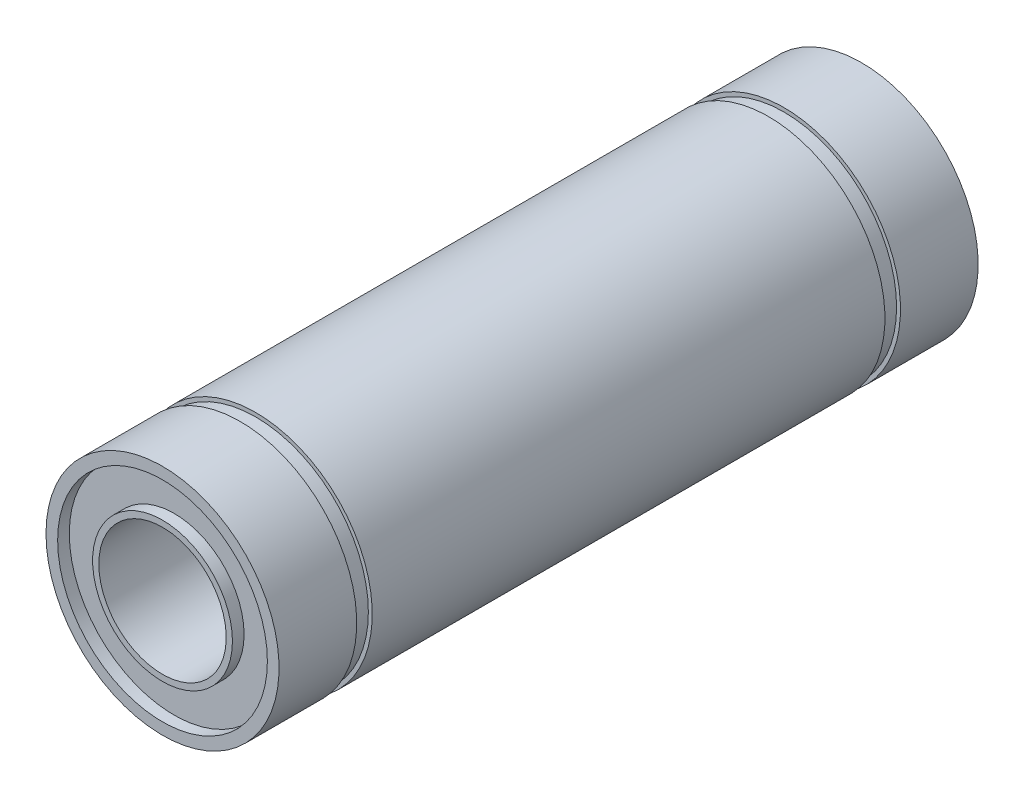
ISO-10303-21;
HEADER;
FILE_DESCRIPTION(('STEP AP214'),'2;1');
FILE_NAME('part.step','',(''),(''),'','','');
FILE_SCHEMA(('AUTOMOTIVE_DESIGN { 1 0 10303 214 1 1 1 1 }'));
ENDSEC;
DATA;
#1=APPLICATION_CONTEXT('core data for automotive mechanical design processes');
#2=APPLICATION_PROTOCOL_DEFINITION('international standard','automotive_design',2000,#1);
#3=PRODUCT_CONTEXT('',#1,'mechanical');
#4=PRODUCT('Part','Part','',(#3));
#5=PRODUCT_RELATED_PRODUCT_CATEGORY('part','',(#4));
#6=PRODUCT_DEFINITION_FORMATION('','',#4);
#7=PRODUCT_DEFINITION_CONTEXT('part definition',#1,'design');
#8=PRODUCT_DEFINITION('design','',#6,#7);
#9=PRODUCT_DEFINITION_SHAPE('','',#8);
#10=(LENGTH_UNIT() NAMED_UNIT(*) SI_UNIT(.MILLI.,.METRE.));
#11=(NAMED_UNIT(*) PLANE_ANGLE_UNIT() SI_UNIT($,.RADIAN.));
#12=(NAMED_UNIT(*) SI_UNIT($,.STERADIAN.) SOLID_ANGLE_UNIT());
#13=UNCERTAINTY_MEASURE_WITH_UNIT(LENGTH_MEASURE(1.E-05),#10,'distance_accuracy_value','');
#14=(GEOMETRIC_REPRESENTATION_CONTEXT(3) GLOBAL_UNCERTAINTY_ASSIGNED_CONTEXT((#13)) GLOBAL_UNIT_ASSIGNED_CONTEXT((#10,
#11,#12)) REPRESENTATION_CONTEXT('',''));
#15=CARTESIAN_POINT('',(0.,0.,0.));
#16=DIRECTION('',(0.,0.,1.));
#17=DIRECTION('',(1.,0.,0.));
#18=AXIS2_PLACEMENT_3D('',#15,#16,#17);
#19=CARTESIAN_POINT('',(0.,0.,45.));
#20=DIRECTION('',(0.,0.,-1.));
#21=DIRECTION('',(-1.,0.,0.));
#22=AXIS2_PLACEMENT_3D('',#19,#20,#21);
#23=CYLINDRICAL_SURFACE('',#22,7.5);
#24=CARTESIAN_POINT('',(0.,0.,0.));
#25=DIRECTION('',(0.,0.,1.));
#26=DIRECTION('',(1.,0.,0.));
#27=AXIS2_PLACEMENT_3D('',#24,#25,#26);
#28=CIRCLE('',#27,7.5);
#29=CARTESIAN_POINT('',(-7.5,0.,0.));
#30=VERTEX_POINT('',#29);
#31=EDGE_CURVE('E34',#30,#30,#28,.T.);
#32=CARTESIAN_POINT('',(0.,0.,5.));
#33=DIRECTION('',(0.,0.,1.));
#34=DIRECTION('',(1.,0.,0.));
#35=AXIS2_PLACEMENT_3D('',#32,#33,#34);
#36=CIRCLE('',#35,7.5);
#37=CARTESIAN_POINT('',(-7.5,0.,5.));
#38=VERTEX_POINT('',#37);
#39=EDGE_CURVE('E84',#38,#38,#36,.T.);
#40=CARTESIAN_POINT('',(-7.5,0.,0.));
#41=CARTESIAN_POINT('',(-7.5,0.,0.0520833333333253));
#42=CARTESIAN_POINT('',(-7.5,0.,0.104166666666657));
#43=CARTESIAN_POINT('',(-7.5,0.,0.208333333333324));
#44=CARTESIAN_POINT('',(-7.5,0.,0.260416666666659));
#45=CARTESIAN_POINT('',(-7.5,0.,0.364583333333328));
#46=CARTESIAN_POINT('',(-7.5,0.,0.416666666666662));
#47=CARTESIAN_POINT('',(-7.5,0.,0.520833333333329));
#48=CARTESIAN_POINT('',(-7.5,0.,0.572916666666661));
#49=CARTESIAN_POINT('',(-7.5,0.,0.677083333333326));
#50=CARTESIAN_POINT('',(-7.5,0.,0.729166666666658));
#51=CARTESIAN_POINT('',(-7.5,0.,0.833333333333325));
#52=CARTESIAN_POINT('',(-7.5,0.,0.885416666666659));
#53=CARTESIAN_POINT('',(-7.5,0.,0.989583333333328));
#54=CARTESIAN_POINT('',(-7.5,0.,1.04166666666666));
#55=CARTESIAN_POINT('',(-7.5,0.,1.14583333333333));
#56=CARTESIAN_POINT('',(-7.5,0.,1.19791666666666));
#57=CARTESIAN_POINT('',(-7.5,0.,1.30208333333333));
#58=CARTESIAN_POINT('',(-7.5,0.,1.35416666666666));
#59=CARTESIAN_POINT('',(-7.5,0.,1.45833333333333));
#60=CARTESIAN_POINT('',(-7.5,0.,1.51041666666666));
#61=CARTESIAN_POINT('',(-7.5,0.,1.61458333333333));
#62=CARTESIAN_POINT('',(-7.5,0.,1.66666666666666));
#63=CARTESIAN_POINT('',(-7.5,0.,1.77083333333333));
#64=CARTESIAN_POINT('',(-7.5,0.,1.82291666666666));
#65=CARTESIAN_POINT('',(-7.5,0.,1.92708333333333));
#66=CARTESIAN_POINT('',(-7.5,0.,1.97916666666666));
#67=CARTESIAN_POINT('',(-7.5,0.,2.08333333333333));
#68=CARTESIAN_POINT('',(-7.5,0.,2.13541666666666));
#69=CARTESIAN_POINT('',(-7.5,0.,2.23958333333333));
#70=CARTESIAN_POINT('',(-7.5,0.,2.29166666666666));
#71=CARTESIAN_POINT('',(-7.5,0.,2.39583333333333));
#72=CARTESIAN_POINT('',(-7.5,0.,2.44791666666666));
#73=CARTESIAN_POINT('',(-7.5,0.,2.55208333333333));
#74=CARTESIAN_POINT('',(-7.5,0.,2.60416666666666));
#75=CARTESIAN_POINT('',(-7.5,0.,2.70833333333333));
#76=CARTESIAN_POINT('',(-7.5,0.,2.76041666666666));
#77=CARTESIAN_POINT('',(-7.5,0.,2.86458333333333));
#78=CARTESIAN_POINT('',(-7.5,0.,2.91666666666666));
#79=CARTESIAN_POINT('',(-7.5,0.,3.02083333333333));
#80=CARTESIAN_POINT('',(-7.5,0.,3.07291666666666));
#81=CARTESIAN_POINT('',(-7.5,0.,3.17708333333333));
#82=CARTESIAN_POINT('',(-7.5,0.,3.22916666666666));
#83=CARTESIAN_POINT('',(-7.5,0.,3.33333333333333));
#84=CARTESIAN_POINT('',(-7.5,0.,3.38541666666666));
#85=CARTESIAN_POINT('',(-7.5,0.,3.48958333333333));
#86=CARTESIAN_POINT('',(-7.5,0.,3.54166666666667));
#87=CARTESIAN_POINT('',(-7.5,0.,3.64583333333333));
#88=CARTESIAN_POINT('',(-7.5,0.,3.69791666666666));
#89=CARTESIAN_POINT('',(-7.5,0.,3.80208333333333));
#90=CARTESIAN_POINT('',(-7.5,0.,3.85416666666666));
#91=CARTESIAN_POINT('',(-7.5,0.,3.95833333333333));
#92=CARTESIAN_POINT('',(-7.5,0.,4.01041666666666));
#93=CARTESIAN_POINT('',(-7.5,0.,4.11458333333333));
#94=CARTESIAN_POINT('',(-7.5,0.,4.16666666666667));
#95=CARTESIAN_POINT('',(-7.5,0.,4.27083333333333));
#96=CARTESIAN_POINT('',(-7.5,0.,4.32291666666667));
#97=CARTESIAN_POINT('',(-7.5,0.,4.42708333333333));
#98=CARTESIAN_POINT('',(-7.5,0.,4.47916666666666));
#99=CARTESIAN_POINT('',(-7.5,0.,4.58333333333333));
#100=CARTESIAN_POINT('',(-7.5,0.,4.63541666666666));
#101=CARTESIAN_POINT('',(-7.5,0.,4.73958333333333));
#102=CARTESIAN_POINT('',(-7.5,0.,4.79166666666667));
#103=CARTESIAN_POINT('',(-7.5,0.,4.89583333333333));
#104=CARTESIAN_POINT('',(-7.5,0.,4.94791666666667));
#105=CARTESIAN_POINT('',(-7.5,0.,5.));
#106=B_SPLINE_CURVE_WITH_KNOTS('',3,(#40,#41,#42,#43,#44,#45,#46,#47,#48,#49,#50,#51,#52,#53,
#54,#55,#56,#57,#58,#59,#60,#61,#62,#63,#64,#65,#66,#67,#68,#69,#70,#71,#72,#73,#74,#75,#76,#77,
#78,#79,#80,#81,#82,#83,#84,#85,#86,#87,#88,#89,#90,#91,#92,#93,#94,#95,#96,#97,#98,#99,#100,
#101,#102,#103,#104,#105),.UNSPECIFIED.,.F.,.F.,(4,2,2,2,2,2,2,2,2,2,2,2,2,2,2,2,2,2,2,2,2,2,2,
2,2,2,2,2,2,2,2,2,4),(0.,0.156249999999997,0.3125,0.468750000000004,0.625000000000001,
0.781249999999997,0.937500000000001,1.09375,1.25,1.40625,1.5625,1.71875,1.875,2.03125,2.1875,
2.34375000000001,2.5,2.65625,2.8125,2.96875000000001,3.125,3.28125,3.4375,3.59375000000001,3.75,
3.90625,4.0625,4.21875000000001,4.375,4.53125,4.6875,4.84375000000001,5.),.UNSPECIFIED.);
#107=EDGE_CURVE('BSEAM31',#30,#38,#106,.T.);
#108=ORIENTED_EDGE('',*,*,#31,.T.);
#109=ORIENTED_EDGE('',*,*,#39,.F.);
#110=ORIENTED_EDGE('',*,*,#107,.T.);
#111=ORIENTED_EDGE('',*,*,#107,.F.);
#112=EDGE_LOOP('',(#108,#110,#109,#111));
#113=FACE_BOUND('',#112,.T.);
#114=ADVANCED_FACE('F31',(#113),#23,.T.);
#115=CARTESIAN_POINT('',(0.,0.,39.));
#116=DIRECTION('',(0.,0.,1.));
#117=DIRECTION('',(1.,0.,0.));
#118=AXIS2_PLACEMENT_3D('',#115,#116,#117);
#119=CIRCLE('',#118,7.5);
#120=CARTESIAN_POINT('',(-7.5,0.,39.));
#121=VERTEX_POINT('',#120);
#122=EDGE_CURVE('E70',#121,#121,#119,.T.);
#123=CARTESIAN_POINT('',(0.,0.,6.));
#124=DIRECTION('',(0.,0.,1.));
#125=DIRECTION('',(1.,0.,0.));
#126=AXIS2_PLACEMENT_3D('',#123,#124,#125);
#127=CIRCLE('',#126,7.5);
#128=CARTESIAN_POINT('',(-7.5,0.,6.));
#129=VERTEX_POINT('',#128);
#130=EDGE_CURVE('E93',#129,#129,#127,.T.);
#131=CARTESIAN_POINT('',(-7.5,0.,39.));
#132=CARTESIAN_POINT('',(-7.5,0.,38.65625));
#133=CARTESIAN_POINT('',(-7.5,0.,38.3125));
#134=CARTESIAN_POINT('',(-7.5,0.,37.625));
#135=CARTESIAN_POINT('',(-7.5,0.,37.28125));
#136=CARTESIAN_POINT('',(-7.5,0.,36.59375));
#137=CARTESIAN_POINT('',(-7.5,0.,36.25));
#138=CARTESIAN_POINT('',(-7.5,0.,35.5625));
#139=CARTESIAN_POINT('',(-7.5,0.,35.21875));
#140=CARTESIAN_POINT('',(-7.5,0.,34.53125));
#141=CARTESIAN_POINT('',(-7.5,0.,34.1875));
#142=CARTESIAN_POINT('',(-7.5,0.,33.5));
#143=CARTESIAN_POINT('',(-7.5,0.,33.15625));
#144=CARTESIAN_POINT('',(-7.5,0.,32.46875));
#145=CARTESIAN_POINT('',(-7.5,0.,32.125));
#146=CARTESIAN_POINT('',(-7.5,0.,31.4375));
#147=CARTESIAN_POINT('',(-7.5,0.,31.09375));
#148=CARTESIAN_POINT('',(-7.5,0.,30.40625));
#149=CARTESIAN_POINT('',(-7.5,0.,30.0625));
#150=CARTESIAN_POINT('',(-7.5,0.,29.375));
#151=CARTESIAN_POINT('',(-7.5,0.,29.03125));
#152=CARTESIAN_POINT('',(-7.5,0.,28.34375));
#153=CARTESIAN_POINT('',(-7.5,0.,28.));
#154=CARTESIAN_POINT('',(-7.5,0.,27.3125));
#155=CARTESIAN_POINT('',(-7.5,0.,26.96875));
#156=CARTESIAN_POINT('',(-7.5,0.,26.28125));
#157=CARTESIAN_POINT('',(-7.5,0.,25.9375));
#158=CARTESIAN_POINT('',(-7.5,0.,25.25));
#159=CARTESIAN_POINT('',(-7.5,0.,24.90625));
#160=CARTESIAN_POINT('',(-7.5,0.,24.21875));
#161=CARTESIAN_POINT('',(-7.5,0.,23.875));
#162=CARTESIAN_POINT('',(-7.5,0.,23.1875));
#163=CARTESIAN_POINT('',(-7.5,0.,22.84375));
#164=CARTESIAN_POINT('',(-7.5,0.,22.15625));
#165=CARTESIAN_POINT('',(-7.5,0.,21.8125));
#166=CARTESIAN_POINT('',(-7.5,0.,21.125));
#167=CARTESIAN_POINT('',(-7.5,0.,20.78125));
#168=CARTESIAN_POINT('',(-7.5,0.,20.09375));
#169=CARTESIAN_POINT('',(-7.5,0.,19.75));
#170=CARTESIAN_POINT('',(-7.5,0.,19.0625));
#171=CARTESIAN_POINT('',(-7.5,0.,18.71875));
#172=CARTESIAN_POINT('',(-7.5,0.,18.03125));
#173=CARTESIAN_POINT('',(-7.5,0.,17.6875));
#174=CARTESIAN_POINT('',(-7.5,0.,17.));
#175=CARTESIAN_POINT('',(-7.5,0.,16.65625));
#176=CARTESIAN_POINT('',(-7.5,0.,15.96875));
#177=CARTESIAN_POINT('',(-7.5,0.,15.625));
#178=CARTESIAN_POINT('',(-7.5,0.,14.9375));
#179=CARTESIAN_POINT('',(-7.5,0.,14.59375));
#180=CARTESIAN_POINT('',(-7.5,0.,13.90625));
#181=CARTESIAN_POINT('',(-7.5,0.,13.5625));
#182=CARTESIAN_POINT('',(-7.5,0.,12.875));
#183=CARTESIAN_POINT('',(-7.5,0.,12.53125));
#184=CARTESIAN_POINT('',(-7.5,0.,11.84375));
#185=CARTESIAN_POINT('',(-7.5,0.,11.5));
#186=CARTESIAN_POINT('',(-7.5,0.,10.8125));
#187=CARTESIAN_POINT('',(-7.5,0.,10.46875));
#188=CARTESIAN_POINT('',(-7.5,0.,9.78125));
#189=CARTESIAN_POINT('',(-7.5,0.,9.4375));
#190=CARTESIAN_POINT('',(-7.5,0.,8.75000000000001));
#191=CARTESIAN_POINT('',(-7.5,0.,8.40625000000001));
#192=CARTESIAN_POINT('',(-7.5,0.,7.71875));
#193=CARTESIAN_POINT('',(-7.5,0.,7.375));
#194=CARTESIAN_POINT('',(-7.5,0.,6.6875));
#195=CARTESIAN_POINT('',(-7.5,0.,6.34375));
#196=CARTESIAN_POINT('',(-7.5,0.,6.));
#197=B_SPLINE_CURVE_WITH_KNOTS('',3,(#131,#132,#133,#134,#135,#136,#137,#138,#139,#140,#141,
#142,#143,#144,#145,#146,#147,#148,#149,#150,#151,#152,#153,#154,#155,#156,#157,#158,#159,#160,
#161,#162,#163,#164,#165,#166,#167,#168,#169,#170,#171,#172,#173,#174,#175,#176,#177,#178,#179,
#180,#181,#182,#183,#184,#185,#186,#187,#188,#189,#190,#191,#192,#193,#194,#195,#196),
.UNSPECIFIED.,.F.,.F.,(4,2,2,2,2,2,2,2,2,2,2,2,2,2,2,2,2,2,2,2,2,2,2,2,2,2,2,2,2,2,2,2,4),(0.,
1.03125,2.0625,3.09375,4.125,5.15625,6.18750000000001,7.21875,8.25,9.28125000000001,10.3125,
11.34375,12.375,13.40625,14.4375,15.46875,16.5,17.53125,18.5625,19.59375,20.625,21.65625,
22.6875,23.71875,24.75,25.78125,26.8125,27.84375,28.875,29.90625,30.9375,31.96875,33.),.UNSPECIFIED.);
#198=EDGE_CURVE('BSEAM97',#121,#129,#197,.T.);
#199=ORIENTED_EDGE('',*,*,#122,.F.);
#200=ORIENTED_EDGE('',*,*,#130,.T.);
#201=ORIENTED_EDGE('',*,*,#198,.T.);
#202=ORIENTED_EDGE('',*,*,#198,.F.);
#203=EDGE_LOOP('',(#199,#201,#200,#202));
#204=FACE_BOUND('',#203,.T.);
#205=ADVANCED_FACE('F97',(#204),#23,.T.);
#206=CARTESIAN_POINT('',(0.,0.,45.));
#207=DIRECTION('',(0.,0.,1.));
#208=DIRECTION('',(1.,0.,0.));
#209=AXIS2_PLACEMENT_3D('',#206,#207,#208);
#210=CIRCLE('',#209,7.5);
#211=CARTESIAN_POINT('',(-7.5,0.,45.));
#212=VERTEX_POINT('',#211);
#213=EDGE_CURVE('E10',#212,#212,#210,.T.);
#214=CARTESIAN_POINT('',(0.,0.,40.));
#215=DIRECTION('',(0.,0.,1.));
#216=DIRECTION('',(1.,0.,0.));
#217=AXIS2_PLACEMENT_3D('',#214,#215,#216);
#218=CIRCLE('',#217,7.5);
#219=CARTESIAN_POINT('',(-7.5,0.,40.));
#220=VERTEX_POINT('',#219);
#221=EDGE_CURVE('E81',#220,#220,#218,.T.);
#222=CARTESIAN_POINT('',(-7.5,0.,45.));
#223=CARTESIAN_POINT('',(-7.5,0.,44.9479166666667));
#224=CARTESIAN_POINT('',(-7.5,0.,44.8958333333333));
#225=CARTESIAN_POINT('',(-7.5,0.,44.7916666666667));
#226=CARTESIAN_POINT('',(-7.5,0.,44.7395833333333));
#227=CARTESIAN_POINT('',(-7.5,0.,44.6354166666667));
#228=CARTESIAN_POINT('',(-7.5,0.,44.5833333333333));
#229=CARTESIAN_POINT('',(-7.5,0.,44.4791666666667));
#230=CARTESIAN_POINT('',(-7.5,0.,44.4270833333333));
#231=CARTESIAN_POINT('',(-7.5,0.,44.3229166666667));
#232=CARTESIAN_POINT('',(-7.5,0.,44.2708333333333));
#233=CARTESIAN_POINT('',(-7.5,0.,44.1666666666667));
#234=CARTESIAN_POINT('',(-7.5,0.,44.1145833333333));
#235=CARTESIAN_POINT('',(-7.5,0.,44.0104166666667));
#236=CARTESIAN_POINT('',(-7.5,0.,43.9583333333333));
#237=CARTESIAN_POINT('',(-7.5,0.,43.8541666666667));
#238=CARTESIAN_POINT('',(-7.5,0.,43.8020833333333));
#239=CARTESIAN_POINT('',(-7.5,0.,43.6979166666667));
#240=CARTESIAN_POINT('',(-7.5,0.,43.6458333333333));
#241=CARTESIAN_POINT('',(-7.5,0.,43.5416666666667));
#242=CARTESIAN_POINT('',(-7.5,0.,43.4895833333333));
#243=CARTESIAN_POINT('',(-7.5,0.,43.3854166666667));
#244=CARTESIAN_POINT('',(-7.5,0.,43.3333333333333));
#245=CARTESIAN_POINT('',(-7.5,0.,43.2291666666667));
#246=CARTESIAN_POINT('',(-7.5,0.,43.1770833333333));
#247=CARTESIAN_POINT('',(-7.5,0.,43.0729166666667));
#248=CARTESIAN_POINT('',(-7.5,0.,43.0208333333333));
#249=CARTESIAN_POINT('',(-7.5,0.,42.9166666666667));
#250=CARTESIAN_POINT('',(-7.5,0.,42.8645833333333));
#251=CARTESIAN_POINT('',(-7.5,0.,42.7604166666667));
#252=CARTESIAN_POINT('',(-7.5,0.,42.7083333333333));
#253=CARTESIAN_POINT('',(-7.5,0.,42.6041666666667));
#254=CARTESIAN_POINT('',(-7.5,0.,42.5520833333333));
#255=CARTESIAN_POINT('',(-7.5,0.,42.4479166666667));
#256=CARTESIAN_POINT('',(-7.5,0.,42.3958333333333));
#257=CARTESIAN_POINT('',(-7.5,0.,42.2916666666667));
#258=CARTESIAN_POINT('',(-7.5,0.,42.2395833333333));
#259=CARTESIAN_POINT('',(-7.5,0.,42.1354166666667));
#260=CARTESIAN_POINT('',(-7.5,0.,42.0833333333333));
#261=CARTESIAN_POINT('',(-7.5,0.,41.9791666666667));
#262=CARTESIAN_POINT('',(-7.5,0.,41.9270833333333));
#263=CARTESIAN_POINT('',(-7.5,0.,41.8229166666667));
#264=CARTESIAN_POINT('',(-7.5,0.,41.7708333333333));
#265=CARTESIAN_POINT('',(-7.5,0.,41.6666666666667));
#266=CARTESIAN_POINT('',(-7.5,0.,41.6145833333333));
#267=CARTESIAN_POINT('',(-7.5,0.,41.5104166666667));
#268=CARTESIAN_POINT('',(-7.5,0.,41.4583333333333));
#269=CARTESIAN_POINT('',(-7.5,0.,41.3541666666667));
#270=CARTESIAN_POINT('',(-7.5,0.,41.3020833333333));
#271=CARTESIAN_POINT('',(-7.5,0.,41.1979166666667));
#272=CARTESIAN_POINT('',(-7.5,0.,41.1458333333333));
#273=CARTESIAN_POINT('',(-7.5,0.,41.0416666666667));
#274=CARTESIAN_POINT('',(-7.5,0.,40.9895833333333));
#275=CARTESIAN_POINT('',(-7.5,0.,40.8854166666667));
#276=CARTESIAN_POINT('',(-7.5,0.,40.8333333333333));
#277=CARTESIAN_POINT('',(-7.5,0.,40.7291666666667));
#278=CARTESIAN_POINT('',(-7.5,0.,40.6770833333333));
#279=CARTESIAN_POINT('',(-7.5,0.,40.5729166666667));
#280=CARTESIAN_POINT('',(-7.5,0.,40.5208333333333));
#281=CARTESIAN_POINT('',(-7.5,0.,40.4166666666667));
#282=CARTESIAN_POINT('',(-7.5,0.,40.3645833333333));
#283=CARTESIAN_POINT('',(-7.5,0.,40.2604166666667));
#284=CARTESIAN_POINT('',(-7.5,0.,40.2083333333333));
#285=CARTESIAN_POINT('',(-7.5,0.,40.1041666666667));
#286=CARTESIAN_POINT('',(-7.5,0.,40.0520833333333));
#287=CARTESIAN_POINT('',(-7.5,0.,40.));
#288=B_SPLINE_CURVE_WITH_KNOTS('',3,(#222,#223,#224,#225,#226,#227,#228,#229,#230,#231,#232,
#233,#234,#235,#236,#237,#238,#239,#240,#241,#242,#243,#244,#245,#246,#247,#248,#249,#250,#251,
#252,#253,#254,#255,#256,#257,#258,#259,#260,#261,#262,#263,#264,#265,#266,#267,#268,#269,#270,
#271,#272,#273,#274,#275,#276,#277,#278,#279,#280,#281,#282,#283,#284,#285,#286,#287),
.UNSPECIFIED.,.F.,.F.,(4,2,2,2,2,2,2,2,2,2,2,2,2,2,2,2,2,2,2,2,2,2,2,2,2,2,2,2,2,2,2,2,4),(0.,
0.156250000000004,0.3125,0.468750000000004,0.625000000000001,0.781250000000004,
0.937500000000001,1.09375,1.25,1.40625,1.5625,1.71875,1.875,2.03125000000001,2.1875,2.34375,2.5,
2.65625,2.8125,2.96875,3.125,3.28125,3.4375,3.59375,3.75,3.90625,4.0625,4.21875,4.375,4.53125,
4.6875,4.84375,5.),.UNSPECIFIED.);
#289=EDGE_CURVE('BSEAM112',#212,#220,#288,.T.);
#290=ORIENTED_EDGE('',*,*,#213,.F.);
#291=ORIENTED_EDGE('',*,*,#221,.T.);
#292=ORIENTED_EDGE('',*,*,#289,.T.);
#293=ORIENTED_EDGE('',*,*,#289,.F.);
#294=EDGE_LOOP('',(#290,#292,#291,#293));
#295=FACE_BOUND('',#294,.T.);
#296=ADVANCED_FACE('F112',(#295),#23,.T.);
#297=CARTESIAN_POINT('',(0.,0.,0.));
#298=DIRECTION('',(0.,0.,1.));
#299=DIRECTION('',(1.,0.,0.));
#300=AXIS2_PLACEMENT_3D('',#297,#298,#299);
#301=PLANE('',#300);
#302=CARTESIAN_POINT('',(0.,0.,0.));
#303=DIRECTION('',(0.,0.,1.));
#304=DIRECTION('',(1.,0.,0.));
#305=AXIS2_PLACEMENT_3D('',#302,#303,#304);
#306=CIRCLE('',#305,4.1);
#307=CARTESIAN_POINT('',(-4.1,0.,0.));
#308=VERTEX_POINT('',#307);
#309=EDGE_CURVE('E43',#308,#308,#306,.T.);
#310=ORIENTED_EDGE('',*,*,#309,.T.);
#311=EDGE_LOOP('',(#310));
#312=FACE_BOUND('',#311,.T.);
#313=CARTESIAN_POINT('',(0.,0.,0.));
#314=DIRECTION('',(0.,0.,-1.));
#315=DIRECTION('',(-1.,0.,0.));
#316=AXIS2_PLACEMENT_3D('',#313,#314,#315);
#317=CIRCLE('',#316,4.5);
#318=CARTESIAN_POINT('',(-4.5,0.,0.));
#319=VERTEX_POINT('',#318);
#320=EDGE_CURVE('E67',#319,#319,#317,.T.);
#321=ORIENTED_EDGE('',*,*,#320,.T.);
#322=EDGE_LOOP('',(#321));
#323=FACE_BOUND('',#322,.T.);
#324=ADVANCED_FACE('F119',(#312,#323),#301,.F.);
#325=CARTESIAN_POINT('',(0.,0.,45.));
#326=DIRECTION('',(0.,0.,1.));
#327=DIRECTION('',(1.,0.,0.));
#328=AXIS2_PLACEMENT_3D('',#325,#326,#327);
#329=PLANE('',#328);
#330=CARTESIAN_POINT('',(0.,0.,45.));
#331=DIRECTION('',(0.,0.,1.));
#332=DIRECTION('',(1.,0.,0.));
#333=AXIS2_PLACEMENT_3D('',#330,#331,#332);
#334=CIRCLE('',#333,4.1);
#335=CARTESIAN_POINT('',(-4.1,0.,45.));
#336=VERTEX_POINT('',#335);
#337=EDGE_CURVE('E41',#336,#336,#334,.T.);
#338=ORIENTED_EDGE('',*,*,#337,.F.);
#339=EDGE_LOOP('',(#338));
#340=FACE_BOUND('',#339,.T.);
#341=CARTESIAN_POINT('',(0.,0.,45.));
#342=DIRECTION('',(0.,0.,1.));
#343=DIRECTION('',(1.,0.,0.));
#344=AXIS2_PLACEMENT_3D('',#341,#342,#343);
#345=CIRCLE('',#344,4.5);
#346=CARTESIAN_POINT('',(4.5,0.,45.));
#347=VERTEX_POINT('',#346);
#348=EDGE_CURVE('E55',#347,#347,#345,.T.);
#349=ORIENTED_EDGE('',*,*,#348,.T.);
#350=EDGE_LOOP('',(#349));
#351=FACE_BOUND('',#350,.T.);
#352=ADVANCED_FACE('F124',(#340,#351),#329,.T.);
#353=CARTESIAN_POINT('',(0.,0.,45.));
#354=DIRECTION('',(0.,0.,1.));
#355=DIRECTION('',(1.,0.,0.));
#356=AXIS2_PLACEMENT_3D('',#353,#354,#355);
#357=CIRCLE('',#356,6.75);
#358=CARTESIAN_POINT('',(6.75,0.,45.));
#359=VERTEX_POINT('',#358);
#360=EDGE_CURVE('E49',#359,#359,#357,.T.);
#361=ORIENTED_EDGE('',*,*,#360,.F.);
#362=EDGE_LOOP('',(#361));
#363=FACE_BOUND('',#362,.T.);
#364=ORIENTED_EDGE('',*,*,#213,.T.);
#365=EDGE_LOOP('',(#364));
#366=FACE_BOUND('',#365,.T.);
#367=ADVANCED_FACE('F176',(#363,#366),#329,.T.);
#368=CARTESIAN_POINT('',(0.,0.,0.));
#369=DIRECTION('',(0.,0.,-1.));
#370=DIRECTION('',(-1.,0.,0.));
#371=AXIS2_PLACEMENT_3D('',#368,#369,#370);
#372=CIRCLE('',#371,7.);
#373=CARTESIAN_POINT('',(-7.,0.,0.));
#374=VERTEX_POINT('',#373);
#375=EDGE_CURVE('E61',#374,#374,#372,.T.);
#376=ORIENTED_EDGE('',*,*,#375,.F.);
#377=EDGE_LOOP('',(#376));
#378=FACE_BOUND('',#377,.T.);
#379=ORIENTED_EDGE('',*,*,#31,.F.);
#380=EDGE_LOOP('',(#379));
#381=FACE_BOUND('',#380,.T.);
#382=ADVANCED_FACE('F126',(#378,#381),#301,.F.);
#383=CARTESIAN_POINT('',(0.,0.,45.));
#384=DIRECTION('',(0.,0.,-1.));
#385=DIRECTION('',(-1.,0.,0.));
#386=AXIS2_PLACEMENT_3D('',#383,#384,#385);
#387=CYLINDRICAL_SURFACE('',#386,4.1);
#388=CARTESIAN_POINT('',(-4.1,0.,45.));
#389=CARTESIAN_POINT('',(-4.1,0.,44.53125));
#390=CARTESIAN_POINT('',(-4.1,0.,44.0625));
#391=CARTESIAN_POINT('',(-4.1,0.,43.125));
#392=CARTESIAN_POINT('',(-4.1,0.,42.65625));
#393=CARTESIAN_POINT('',(-4.1,0.,41.71875));
#394=CARTESIAN_POINT('',(-4.1,0.,41.25));
#395=CARTESIAN_POINT('',(-4.1,0.,40.3125));
#396=CARTESIAN_POINT('',(-4.1,0.,39.84375));
#397=CARTESIAN_POINT('',(-4.1,0.,38.90625));
#398=CARTESIAN_POINT('',(-4.1,0.,38.4375));
#399=CARTESIAN_POINT('',(-4.1,0.,37.5));
#400=CARTESIAN_POINT('',(-4.1,0.,37.03125));
#401=CARTESIAN_POINT('',(-4.1,0.,36.09375));
#402=CARTESIAN_POINT('',(-4.1,0.,35.625));
#403=CARTESIAN_POINT('',(-4.1,0.,34.6875));
#404=CARTESIAN_POINT('',(-4.1,0.,34.21875));
#405=CARTESIAN_POINT('',(-4.1,0.,33.28125));
#406=CARTESIAN_POINT('',(-4.1,0.,32.8125));
#407=CARTESIAN_POINT('',(-4.1,0.,31.875));
#408=CARTESIAN_POINT('',(-4.1,0.,31.40625));
#409=CARTESIAN_POINT('',(-4.1,0.,30.46875));
#410=CARTESIAN_POINT('',(-4.1,0.,30.));
#411=CARTESIAN_POINT('',(-4.1,0.,29.0625));
#412=CARTESIAN_POINT('',(-4.1,0.,28.59375));
#413=CARTESIAN_POINT('',(-4.1,0.,27.65625));
#414=CARTESIAN_POINT('',(-4.1,0.,27.1875));
#415=CARTESIAN_POINT('',(-4.1,0.,26.25));
#416=CARTESIAN_POINT('',(-4.1,0.,25.78125));
#417=CARTESIAN_POINT('',(-4.1,0.,24.84375));
#418=CARTESIAN_POINT('',(-4.1,0.,24.375));
#419=CARTESIAN_POINT('',(-4.1,0.,23.4375));
#420=CARTESIAN_POINT('',(-4.1,0.,22.96875));
#421=CARTESIAN_POINT('',(-4.1,0.,22.03125));
#422=CARTESIAN_POINT('',(-4.1,0.,21.5625));
#423=CARTESIAN_POINT('',(-4.1,0.,20.625));
#424=CARTESIAN_POINT('',(-4.1,0.,20.15625));
#425=CARTESIAN_POINT('',(-4.1,0.,19.21875));
#426=CARTESIAN_POINT('',(-4.1,0.,18.75));
#427=CARTESIAN_POINT('',(-4.1,0.,17.8125));
#428=CARTESIAN_POINT('',(-4.1,0.,17.34375));
#429=CARTESIAN_POINT('',(-4.1,0.,16.40625));
#430=CARTESIAN_POINT('',(-4.1,0.,15.9375));
#431=CARTESIAN_POINT('',(-4.1,0.,15.));
#432=CARTESIAN_POINT('',(-4.1,0.,14.53125));
#433=CARTESIAN_POINT('',(-4.1,0.,13.59375));
#434=CARTESIAN_POINT('',(-4.1,0.,13.125));
#435=CARTESIAN_POINT('',(-4.1,0.,12.1875));
#436=CARTESIAN_POINT('',(-4.1,0.,11.71875));
#437=CARTESIAN_POINT('',(-4.1,0.,10.78125));
#438=CARTESIAN_POINT('',(-4.1,0.,10.3125));
#439=CARTESIAN_POINT('',(-4.1,0.,9.375));
#440=CARTESIAN_POINT('',(-4.1,0.,8.90625));
#441=CARTESIAN_POINT('',(-4.1,0.,7.96874999999999));
#442=CARTESIAN_POINT('',(-4.1,0.,7.5));
#443=CARTESIAN_POINT('',(-4.1,0.,6.5625));
#444=CARTESIAN_POINT('',(-4.1,0.,6.09375));
#445=CARTESIAN_POINT('',(-4.1,0.,5.15625));
#446=CARTESIAN_POINT('',(-4.1,0.,4.68749999999999));
#447=CARTESIAN_POINT('',(-4.1,0.,3.74999999999999));
#448=CARTESIAN_POINT('',(-4.1,0.,3.28124999999999));
#449=CARTESIAN_POINT('',(-4.1,0.,2.34374999999999));
#450=CARTESIAN_POINT('',(-4.1,0.,1.87499999999999));
#451=CARTESIAN_POINT('',(-4.1,0.,0.937499999999992));
#452=CARTESIAN_POINT('',(-4.1,0.,0.468749999999993));
#453=CARTESIAN_POINT('',(-4.1,0.,0.));
#454=B_SPLINE_CURVE_WITH_KNOTS('',3,(#388,#389,#390,#391,#392,#393,#394,#395,#396,#397,#398,
#399,#400,#401,#402,#403,#404,#405,#406,#407,#408,#409,#410,#411,#412,#413,#414,#415,#416,#417,
#418,#419,#420,#421,#422,#423,#424,#425,#426,#427,#428,#429,#430,#431,#432,#433,#434,#435,#436,
#437,#438,#439,#440,#441,#442,#443,#444,#445,#446,#447,#448,#449,#450,#451,#452,#453),
.UNSPECIFIED.,.F.,.F.,(4,2,2,2,2,2,2,2,2,2,2,2,2,2,2,2,2,2,2,2,2,2,2,2,2,2,2,2,2,2,2,2,4),(0.,
1.40625,2.8125,4.21875000000001,5.62500000000001,7.03125,8.4375,9.84375000000001,11.25,12.65625,
14.0625,15.46875,16.875,18.28125,19.6875,21.09375,22.5,23.90625,25.3125,26.71875,28.125,
29.53125,30.9375,32.34375,33.75,35.15625,36.5625,37.96875,39.375,40.78125,42.1875,43.59375,45.),.UNSPECIFIED.);
#455=EDGE_CURVE('BSEAM171',#336,#308,#454,.T.);
#456=ORIENTED_EDGE('',*,*,#337,.T.);
#457=ORIENTED_EDGE('',*,*,#309,.F.);
#458=ORIENTED_EDGE('',*,*,#455,.T.);
#459=ORIENTED_EDGE('',*,*,#455,.F.);
#460=EDGE_LOOP('',(#456,#458,#457,#459));
#461=FACE_BOUND('',#460,.T.);
#462=ADVANCED_FACE('F171',(#461),#387,.F.);
#463=CARTESIAN_POINT('',(0.,0.,44.25));
#464=DIRECTION('',(0.,0.,1.));
#465=DIRECTION('',(1.,0.,0.));
#466=AXIS2_PLACEMENT_3D('',#463,#464,#465);
#467=CYLINDRICAL_SURFACE('',#466,6.75);
#468=CARTESIAN_POINT('',(0.,0.,44.25));
#469=DIRECTION('',(0.,0.,1.));
#470=DIRECTION('',(1.,0.,0.));
#471=AXIS2_PLACEMENT_3D('',#468,#469,#470);
#472=CIRCLE('',#471,6.75);
#473=CARTESIAN_POINT('',(6.75,0.,44.25));
#474=VERTEX_POINT('',#473);
#475=EDGE_CURVE('E46',#474,#474,#472,.T.);
#476=ORIENTED_EDGE('',*,*,#475,.F.);
#477=EDGE_LOOP('',(#476));
#478=FACE_BOUND('',#477,.T.);
#479=ORIENTED_EDGE('',*,*,#360,.T.);
#480=EDGE_LOOP('',(#479));
#481=FACE_BOUND('',#480,.T.);
#482=ADVANCED_FACE('F167',(#478,#481),#467,.F.);
#483=CARTESIAN_POINT('',(0.,0.,44.25));
#484=DIRECTION('',(0.,0.,1.));
#485=DIRECTION('',(1.,0.,0.));
#486=AXIS2_PLACEMENT_3D('',#483,#484,#485);
#487=PLANE('',#486);
#488=CARTESIAN_POINT('',(0.,0.,44.25));
#489=DIRECTION('',(0.,0.,1.));
#490=DIRECTION('',(1.,0.,0.));
#491=AXIS2_PLACEMENT_3D('',#488,#489,#490);
#492=CIRCLE('',#491,4.5);
#493=CARTESIAN_POINT('',(4.5,0.,44.25));
#494=VERTEX_POINT('',#493);
#495=EDGE_CURVE('E52',#494,#494,#492,.T.);
#496=ORIENTED_EDGE('',*,*,#495,.F.);
#497=EDGE_LOOP('',(#496));
#498=FACE_BOUND('',#497,.T.);
#499=ORIENTED_EDGE('',*,*,#475,.T.);
#500=EDGE_LOOP('',(#499));
#501=FACE_BOUND('',#500,.T.);
#502=ADVANCED_FACE('F163',(#498,#501),#487,.T.);
#503=CARTESIAN_POINT('',(0.,0.,44.25));
#504=DIRECTION('',(0.,0.,1.));
#505=DIRECTION('',(1.,0.,0.));
#506=AXIS2_PLACEMENT_3D('',#503,#504,#505);
#507=CYLINDRICAL_SURFACE('',#506,4.5);
#508=ORIENTED_EDGE('',*,*,#495,.T.);
#509=EDGE_LOOP('',(#508));
#510=FACE_BOUND('',#509,.T.);
#511=ORIENTED_EDGE('',*,*,#348,.F.);
#512=EDGE_LOOP('',(#511));
#513=FACE_BOUND('',#512,.T.);
#514=ADVANCED_FACE('F159',(#510,#513),#507,.T.);
#515=CARTESIAN_POINT('',(0.,0.,0.75));
#516=DIRECTION('',(0.,0.,-1.));
#517=DIRECTION('',(-1.,0.,0.));
#518=AXIS2_PLACEMENT_3D('',#515,#516,#517);
#519=CYLINDRICAL_SURFACE('',#518,7.);
#520=CARTESIAN_POINT('',(0.,0.,0.75));
#521=DIRECTION('',(0.,0.,-1.));
#522=DIRECTION('',(-1.,0.,0.));
#523=AXIS2_PLACEMENT_3D('',#520,#521,#522);
#524=CIRCLE('',#523,7.);
#525=CARTESIAN_POINT('',(-7.,0.,0.75));
#526=VERTEX_POINT('',#525);
#527=EDGE_CURVE('E58',#526,#526,#524,.T.);
#528=ORIENTED_EDGE('',*,*,#527,.F.);
#529=EDGE_LOOP('',(#528));
#530=FACE_BOUND('',#529,.T.);
#531=ORIENTED_EDGE('',*,*,#375,.T.);
#532=EDGE_LOOP('',(#531));
#533=FACE_BOUND('',#532,.T.);
#534=ADVANCED_FACE('F155',(#530,#533),#519,.F.);
#535=CARTESIAN_POINT('',(0.,0.,0.75));
#536=DIRECTION('',(0.,0.,-1.));
#537=DIRECTION('',(-1.,0.,0.));
#538=AXIS2_PLACEMENT_3D('',#535,#536,#537);
#539=PLANE('',#538);
#540=CARTESIAN_POINT('',(0.,0.,0.75));
#541=DIRECTION('',(0.,0.,-1.));
#542=DIRECTION('',(-1.,0.,0.));
#543=AXIS2_PLACEMENT_3D('',#540,#541,#542);
#544=CIRCLE('',#543,4.5);
#545=CARTESIAN_POINT('',(-4.5,0.,0.75));
#546=VERTEX_POINT('',#545);
#547=EDGE_CURVE('E64',#546,#546,#544,.T.);
#548=ORIENTED_EDGE('',*,*,#547,.F.);
#549=EDGE_LOOP('',(#548));
#550=FACE_BOUND('',#549,.T.);
#551=ORIENTED_EDGE('',*,*,#527,.T.);
#552=EDGE_LOOP('',(#551));
#553=FACE_BOUND('',#552,.T.);
#554=ADVANCED_FACE('F151',(#550,#553),#539,.T.);
#555=CARTESIAN_POINT('',(0.,0.,0.75));
#556=DIRECTION('',(0.,0.,-1.));
#557=DIRECTION('',(-1.,0.,0.));
#558=AXIS2_PLACEMENT_3D('',#555,#556,#557);
#559=CYLINDRICAL_SURFACE('',#558,4.5);
#560=ORIENTED_EDGE('',*,*,#547,.T.);
#561=EDGE_LOOP('',(#560));
#562=FACE_BOUND('',#561,.T.);
#563=ORIENTED_EDGE('',*,*,#320,.F.);
#564=EDGE_LOOP('',(#563));
#565=FACE_BOUND('',#564,.T.);
#566=ADVANCED_FACE('F147',(#562,#565),#559,.T.);
#567=CARTESIAN_POINT('',(-7.5,0.,39.));
#568=DIRECTION('',(0.,0.,1.));
#569=DIRECTION('',(1.,0.,0.));
#570=AXIS2_PLACEMENT_3D('',#567,#568,#569);
#571=PLANE('',#570);
#572=ORIENTED_EDGE('',*,*,#122,.T.);
#573=EDGE_LOOP('',(#572));
#574=FACE_BOUND('',#573,.T.);
#575=CARTESIAN_POINT('',(0.,0.,39.));
#576=DIRECTION('',(0.,0.,1.));
#577=DIRECTION('',(1.,0.,0.));
#578=AXIS2_PLACEMENT_3D('',#575,#576,#577);
#579=CIRCLE('',#578,7.25);
#580=CARTESIAN_POINT('',(7.25,0.,39.));
#581=VERTEX_POINT('',#580);
#582=EDGE_CURVE('E75',#581,#581,#579,.T.);
#583=ORIENTED_EDGE('',*,*,#582,.F.);
#584=EDGE_LOOP('',(#583));
#585=FACE_BOUND('',#584,.T.);
#586=ADVANCED_FACE('F141',(#574,#585),#571,.T.);
#587=CARTESIAN_POINT('',(0.,0.,45.));
#588=DIRECTION('',(0.,0.,1.));
#589=DIRECTION('',(1.,0.,0.));
#590=AXIS2_PLACEMENT_3D('',#587,#588,#589);
#591=CYLINDRICAL_SURFACE('',#590,7.25);
#592=ORIENTED_EDGE('',*,*,#582,.T.);
#593=EDGE_LOOP('',(#592));
#594=FACE_BOUND('',#593,.T.);
#595=CARTESIAN_POINT('',(0.,0.,40.));
#596=DIRECTION('',(0.,0.,1.));
#597=DIRECTION('',(1.,0.,0.));
#598=AXIS2_PLACEMENT_3D('',#595,#596,#597);
#599=CIRCLE('',#598,7.25);
#600=CARTESIAN_POINT('',(7.25,0.,40.));
#601=VERTEX_POINT('',#600);
#602=EDGE_CURVE('E78',#601,#601,#599,.T.);
#603=ORIENTED_EDGE('',*,*,#602,.F.);
#604=EDGE_LOOP('',(#603));
#605=FACE_BOUND('',#604,.T.);
#606=ADVANCED_FACE('F132',(#594,#605),#591,.T.);
#607=CARTESIAN_POINT('',(-7.5,0.,40.));
#608=DIRECTION('',(0.,0.,-1.));
#609=DIRECTION('',(-1.,0.,0.));
#610=AXIS2_PLACEMENT_3D('',#607,#608,#609);
#611=PLANE('',#610);
#612=ORIENTED_EDGE('',*,*,#602,.T.);
#613=EDGE_LOOP('',(#612));
#614=FACE_BOUND('',#613,.T.);
#615=ORIENTED_EDGE('',*,*,#221,.F.);
#616=EDGE_LOOP('',(#615));
#617=FACE_BOUND('',#616,.T.);
#618=ADVANCED_FACE('F130',(#614,#617),#611,.T.);
#619=CARTESIAN_POINT('',(-7.5,0.,5.));
#620=DIRECTION('',(0.,0.,1.));
#621=DIRECTION('',(1.,0.,0.));
#622=AXIS2_PLACEMENT_3D('',#619,#620,#621);
#623=PLANE('',#622);
#624=ORIENTED_EDGE('',*,*,#39,.T.);
#625=EDGE_LOOP('',(#624));
#626=FACE_BOUND('',#625,.T.);
#627=CARTESIAN_POINT('',(0.,0.,5.));
#628=DIRECTION('',(0.,0.,1.));
#629=DIRECTION('',(1.,0.,0.));
#630=AXIS2_PLACEMENT_3D('',#627,#628,#629);
#631=CIRCLE('',#630,7.25);
#632=CARTESIAN_POINT('',(7.25,0.,5.));
#633=VERTEX_POINT('',#632);
#634=EDGE_CURVE('E87',#633,#633,#631,.T.);
#635=ORIENTED_EDGE('',*,*,#634,.F.);
#636=EDGE_LOOP('',(#635));
#637=FACE_BOUND('',#636,.T.);
#638=ADVANCED_FACE('F107',(#626,#637),#623,.T.);
#639=CARTESIAN_POINT('',(0.,0.,45.));
#640=DIRECTION('',(0.,0.,1.));
#641=DIRECTION('',(1.,0.,0.));
#642=AXIS2_PLACEMENT_3D('',#639,#640,#641);
#643=CYLINDRICAL_SURFACE('',#642,7.25);
#644=ORIENTED_EDGE('',*,*,#634,.T.);
#645=EDGE_LOOP('',(#644));
#646=FACE_BOUND('',#645,.T.);
#647=CARTESIAN_POINT('',(0.,0.,6.));
#648=DIRECTION('',(0.,0.,1.));
#649=DIRECTION('',(1.,0.,0.));
#650=AXIS2_PLACEMENT_3D('',#647,#648,#649);
#651=CIRCLE('',#650,7.25);
#652=CARTESIAN_POINT('',(7.25,0.,6.));
#653=VERTEX_POINT('',#652);
#654=EDGE_CURVE('E90',#653,#653,#651,.T.);
#655=ORIENTED_EDGE('',*,*,#654,.F.);
#656=EDGE_LOOP('',(#655));
#657=FACE_BOUND('',#656,.T.);
#658=ADVANCED_FACE('F101',(#646,#657),#643,.T.);
#659=CARTESIAN_POINT('',(-7.5,0.,6.));
#660=DIRECTION('',(0.,0.,-1.));
#661=DIRECTION('',(-1.,0.,0.));
#662=AXIS2_PLACEMENT_3D('',#659,#660,#661);
#663=PLANE('',#662);
#664=ORIENTED_EDGE('',*,*,#654,.T.);
#665=EDGE_LOOP('',(#664));
#666=FACE_BOUND('',#665,.T.);
#667=ORIENTED_EDGE('',*,*,#130,.F.);
#668=EDGE_LOOP('',(#667));
#669=FACE_BOUND('',#668,.T.);
#670=ADVANCED_FACE('F99',(#666,#669),#663,.T.);
#671=CLOSED_SHELL('',(#114,#205,#296,#324,#352,#367,#382,#462,#482,#502,#514,#534,#554,#566,
#586,#606,#618,#638,#658,#670));
#672=MANIFOLD_SOLID_BREP('B2',#671);
#673=ADVANCED_BREP_SHAPE_REPRESENTATION('',(#18,#672),#14);
#674=SHAPE_DEFINITION_REPRESENTATION(#9,#673);
ENDSEC;
END-ISO-10303-21;
